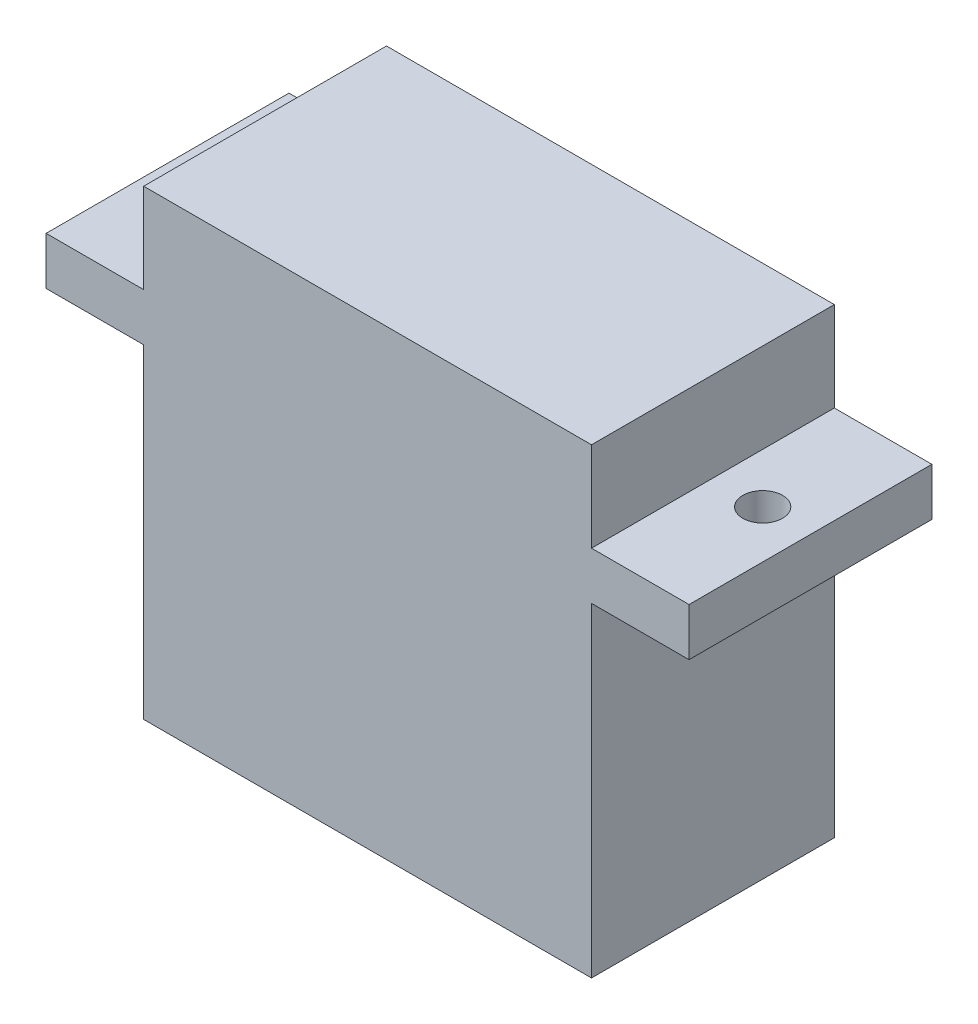
ISO-10303-21;
HEADER;
FILE_DESCRIPTION(('STEP AP214'),'2;1');
FILE_NAME('part.step','',(''),(''),'','','');
FILE_SCHEMA(('AUTOMOTIVE_DESIGN { 1 0 10303 214 1 1 1 1 }'));
ENDSEC;
DATA;
#1=APPLICATION_CONTEXT('core data for automotive mechanical design processes');
#2=APPLICATION_PROTOCOL_DEFINITION('international standard','automotive_design',2000,#1);
#3=PRODUCT_CONTEXT('',#1,'mechanical');
#4=PRODUCT('Part','Part','',(#3));
#5=PRODUCT_RELATED_PRODUCT_CATEGORY('part','',(#4));
#6=PRODUCT_DEFINITION_FORMATION('','',#4);
#7=PRODUCT_DEFINITION_CONTEXT('part definition',#1,'design');
#8=PRODUCT_DEFINITION('design','',#6,#7);
#9=PRODUCT_DEFINITION_SHAPE('','',#8);
#10=(LENGTH_UNIT() NAMED_UNIT(*) SI_UNIT(.MILLI.,.METRE.));
#11=(NAMED_UNIT(*) PLANE_ANGLE_UNIT() SI_UNIT($,.RADIAN.));
#12=(NAMED_UNIT(*) SI_UNIT($,.STERADIAN.) SOLID_ANGLE_UNIT());
#13=UNCERTAINTY_MEASURE_WITH_UNIT(LENGTH_MEASURE(1.E-05),#10,'distance_accuracy_value','');
#14=(GEOMETRIC_REPRESENTATION_CONTEXT(3) GLOBAL_UNCERTAINTY_ASSIGNED_CONTEXT((#13)) GLOBAL_UNIT_ASSIGNED_CONTEXT((#10,
#11,#12)) REPRESENTATION_CONTEXT('',''));
#15=CARTESIAN_POINT('',(0.,0.,0.));
#16=DIRECTION('',(0.,0.,1.));
#17=DIRECTION('',(1.,0.,0.));
#18=AXIS2_PLACEMENT_3D('',#15,#16,#17);
#19=CARTESIAN_POINT('',(16.15,2.4,6.10000000000001));
#20=DIRECTION('',(0.,1.,0.));
#21=DIRECTION('',(0.,0.,1.));
#22=AXIS2_PLACEMENT_3D('',#19,#20,#21);
#23=PLANE('',#22);
#24=DIRECTION('',(0.,0.,-1.));
#25=VECTOR('',#24,1.);
#26=CARTESIAN_POINT('',(11.25,2.4,6.10000000000001));
#27=LINE('',#26,#25);
#28=CARTESIAN_POINT('',(11.25,2.4,6.09999999999999));
#29=VERTEX_POINT('',#28);
#30=CARTESIAN_POINT('',(11.25,2.4,-6.09999999999999));
#31=VERTEX_POINT('',#30);
#32=EDGE_CURVE('E183',#29,#31,#27,.T.);
#33=ORIENTED_EDGE('',*,*,#32,.F.);
#34=DIRECTION('',(1.,0.,0.));
#35=VECTOR('',#34,1.);
#36=CARTESIAN_POINT('',(-16.15,2.4,6.10000000000001));
#37=LINE('',#36,#35);
#38=CARTESIAN_POINT('',(16.15,2.4,6.10000000000001));
#39=VERTEX_POINT('',#38);
#40=EDGE_CURVE('E205',#29,#39,#37,.T.);
#41=ORIENTED_EDGE('',*,*,#40,.T.);
#42=DIRECTION('',(0.,0.,-1.));
#43=VECTOR('',#42,1.);
#44=CARTESIAN_POINT('',(16.15,2.4,-6.09999999999999));
#45=LINE('',#44,#43);
#46=CARTESIAN_POINT('',(16.15,2.4,-6.09999999999999));
#47=VERTEX_POINT('',#46);
#48=EDGE_CURVE('E198',#39,#47,#45,.T.);
#49=ORIENTED_EDGE('',*,*,#48,.T.);
#50=DIRECTION('',(-1.,0.,0.));
#51=VECTOR('',#50,1.);
#52=CARTESIAN_POINT('',(-16.15,2.4,-6.09999999999999));
#53=LINE('',#52,#51);
#54=EDGE_CURVE('E58',#47,#31,#53,.T.);
#55=ORIENTED_EDGE('',*,*,#54,.T.);
#56=EDGE_LOOP('',(#33,#41,#49,#55));
#57=FACE_BOUND('',#56,.T.);
#58=CARTESIAN_POINT('',(13.75,2.4,0.));
#59=DIRECTION('',(0.,1.,0.));
#60=DIRECTION('',(0.,0.,1.));
#61=AXIS2_PLACEMENT_3D('',#58,#59,#60);
#62=CIRCLE('',#61,1.);
#63=CARTESIAN_POINT('',(13.75,2.4,0.999999999999997));
#64=VERTEX_POINT('',#63);
#65=EDGE_CURVE('E186',#64,#64,#62,.T.);
#66=ORIENTED_EDGE('',*,*,#65,.F.);
#67=EDGE_LOOP('',(#66));
#68=FACE_BOUND('',#67,.T.);
#69=ADVANCED_FACE('F35',(#57,#68),#23,.T.);
#70=CARTESIAN_POINT('',(16.15,0.,6.10000000000001));
#71=DIRECTION('',(0.,1.,0.));
#72=DIRECTION('',(0.,0.,1.));
#73=AXIS2_PLACEMENT_3D('',#70,#71,#72);
#74=PLANE('',#73);
#75=CARTESIAN_POINT('',(13.75,0.,0.));
#76=DIRECTION('',(0.,1.,0.));
#77=DIRECTION('',(0.,0.,1.));
#78=AXIS2_PLACEMENT_3D('',#75,#76,#77);
#79=CIRCLE('',#78,1.);
#80=CARTESIAN_POINT('',(13.75,0.,0.999999999999997));
#81=VERTEX_POINT('',#80);
#82=EDGE_CURVE('E185',#81,#81,#79,.T.);
#83=ORIENTED_EDGE('',*,*,#82,.T.);
#84=EDGE_LOOP('',(#83));
#85=FACE_BOUND('',#84,.T.);
#86=DIRECTION('',(1.,0.,0.));
#87=VECTOR('',#86,1.);
#88=CARTESIAN_POINT('',(-16.15,0.,6.10000000000001));
#89=LINE('',#88,#87);
#90=CARTESIAN_POINT('',(11.25,0.,6.10000000000001));
#91=VERTEX_POINT('',#90);
#92=CARTESIAN_POINT('',(16.15,0.,6.10000000000001));
#93=VERTEX_POINT('',#92);
#94=EDGE_CURVE('E217',#91,#93,#89,.T.);
#95=ORIENTED_EDGE('',*,*,#94,.F.);
#96=DIRECTION('',(0.,0.,-1.));
#97=VECTOR('',#96,1.);
#98=CARTESIAN_POINT('',(11.25,0.,6.10000000000001));
#99=LINE('',#98,#97);
#100=CARTESIAN_POINT('',(11.25,0.,-6.09999999999999));
#101=VERTEX_POINT('',#100);
#102=EDGE_CURVE('E131',#91,#101,#99,.T.);
#103=ORIENTED_EDGE('',*,*,#102,.T.);
#104=DIRECTION('',(-1.,0.,0.));
#105=VECTOR('',#104,1.);
#106=CARTESIAN_POINT('',(-16.15,0.,-6.09999999999999));
#107=LINE('',#106,#105);
#108=CARTESIAN_POINT('',(16.15,0.,-6.09999999999999));
#109=VERTEX_POINT('',#108);
#110=EDGE_CURVE('E212',#109,#101,#107,.T.);
#111=ORIENTED_EDGE('',*,*,#110,.F.);
#112=DIRECTION('',(0.,0.,-1.));
#113=VECTOR('',#112,1.);
#114=CARTESIAN_POINT('',(16.15,0.,-6.09999999999999));
#115=LINE('',#114,#113);
#116=EDGE_CURVE('E195',#93,#109,#115,.T.);
#117=ORIENTED_EDGE('',*,*,#116,.F.);
#118=EDGE_LOOP('',(#95,#103,#111,#117));
#119=FACE_BOUND('',#118,.T.);
#120=ADVANCED_FACE('F256',(#85,#119),#74,.F.);
#121=DIRECTION('',(0.,0.,1.));
#122=VECTOR('',#121,1.);
#123=CARTESIAN_POINT('',(-11.25,2.4,6.10000000000001));
#124=LINE('',#123,#122);
#125=CARTESIAN_POINT('',(-11.25,2.4,-6.09999999999999));
#126=VERTEX_POINT('',#125);
#127=CARTESIAN_POINT('',(-11.25,2.4,6.10000000000001));
#128=VERTEX_POINT('',#127);
#129=EDGE_CURVE('E50',#126,#128,#124,.T.);
#130=ORIENTED_EDGE('',*,*,#129,.F.);
#131=CARTESIAN_POINT('',(-16.15,2.4,-6.09999999999999));
#132=VERTEX_POINT('',#131);
#133=EDGE_CURVE('E200',#126,#132,#53,.T.);
#134=ORIENTED_EDGE('',*,*,#133,.T.);
#135=DIRECTION('',(0.,0.,1.));
#136=VECTOR('',#135,1.);
#137=CARTESIAN_POINT('',(-16.15,2.4,-6.09999999999999));
#138=LINE('',#137,#136);
#139=CARTESIAN_POINT('',(-16.15,2.4,6.10000000000001));
#140=VERTEX_POINT('',#139);
#141=EDGE_CURVE('E203',#132,#140,#138,.T.);
#142=ORIENTED_EDGE('',*,*,#141,.T.);
#143=EDGE_CURVE('E206',#140,#128,#37,.T.);
#144=ORIENTED_EDGE('',*,*,#143,.T.);
#145=EDGE_LOOP('',(#130,#134,#142,#144));
#146=FACE_BOUND('',#145,.T.);
#147=CARTESIAN_POINT('',(-13.75,2.4,0.));
#148=DIRECTION('',(0.,1.,0.));
#149=DIRECTION('',(0.,0.,1.));
#150=AXIS2_PLACEMENT_3D('',#147,#148,#149);
#151=CIRCLE('',#150,1.);
#152=CARTESIAN_POINT('',(-13.75,2.4,1.));
#153=VERTEX_POINT('',#152);
#154=EDGE_CURVE('E192',#153,#153,#151,.T.);
#155=ORIENTED_EDGE('',*,*,#154,.F.);
#156=EDGE_LOOP('',(#155));
#157=FACE_BOUND('',#156,.T.);
#158=ADVANCED_FACE('F236',(#146,#157),#23,.T.);
#159=CARTESIAN_POINT('',(-13.75,0.,0.));
#160=DIRECTION('',(0.,1.,0.));
#161=DIRECTION('',(0.,0.,1.));
#162=AXIS2_PLACEMENT_3D('',#159,#160,#161);
#163=CIRCLE('',#162,1.);
#164=CARTESIAN_POINT('',(-13.75,0.,1.));
#165=VERTEX_POINT('',#164);
#166=EDGE_CURVE('E189',#165,#165,#163,.T.);
#167=ORIENTED_EDGE('',*,*,#166,.T.);
#168=EDGE_LOOP('',(#167));
#169=FACE_BOUND('',#168,.T.);
#170=CARTESIAN_POINT('',(-11.25,0.,-6.09999999999999));
#171=VERTEX_POINT('',#170);
#172=CARTESIAN_POINT('',(-16.15,0.,-6.09999999999999));
#173=VERTEX_POINT('',#172);
#174=EDGE_CURVE('E211',#171,#173,#107,.T.);
#175=ORIENTED_EDGE('',*,*,#174,.F.);
#176=DIRECTION('',(0.,0.,1.));
#177=VECTOR('',#176,1.);
#178=CARTESIAN_POINT('',(-11.25,0.,6.10000000000001));
#179=LINE('',#178,#177);
#180=CARTESIAN_POINT('',(-11.25,0.,6.09999999999999));
#181=VERTEX_POINT('',#180);
#182=EDGE_CURVE('E169',#171,#181,#179,.T.);
#183=ORIENTED_EDGE('',*,*,#182,.T.);
#184=CARTESIAN_POINT('',(-16.15,0.,6.10000000000001));
#185=VERTEX_POINT('',#184);
#186=EDGE_CURVE('E201',#185,#181,#89,.T.);
#187=ORIENTED_EDGE('',*,*,#186,.F.);
#188=DIRECTION('',(0.,0.,1.));
#189=VECTOR('',#188,1.);
#190=CARTESIAN_POINT('',(-16.15,0.,-6.09999999999999));
#191=LINE('',#190,#189);
#192=EDGE_CURVE('E215',#173,#185,#191,.T.);
#193=ORIENTED_EDGE('',*,*,#192,.F.);
#194=EDGE_LOOP('',(#175,#183,#187,#193));
#195=FACE_BOUND('',#194,.T.);
#196=ADVANCED_FACE('F234',(#169,#195),#74,.F.);
#197=CARTESIAN_POINT('',(16.15,2.4,-6.09999999999999));
#198=DIRECTION('',(-1.,0.,0.));
#199=DIRECTION('',(0.,0.,1.));
#200=AXIS2_PLACEMENT_3D('',#197,#198,#199);
#201=PLANE('',#200);
#202=ORIENTED_EDGE('',*,*,#116,.T.);
#203=DIRECTION('',(0.,-1.,0.));
#204=VECTOR('',#203,1.);
#205=CARTESIAN_POINT('',(16.15,2.4,-6.09999999999999));
#206=LINE('',#205,#204);
#207=EDGE_CURVE('E11',#47,#109,#206,.T.);
#208=ORIENTED_EDGE('',*,*,#207,.F.);
#209=ORIENTED_EDGE('',*,*,#48,.F.);
#210=DIRECTION('',(0.,-1.,0.));
#211=VECTOR('',#210,1.);
#212=CARTESIAN_POINT('',(16.15,2.4,6.10000000000001));
#213=LINE('',#212,#211);
#214=EDGE_CURVE('E208',#39,#93,#213,.T.);
#215=ORIENTED_EDGE('',*,*,#214,.T.);
#216=EDGE_LOOP('',(#202,#208,#209,#215));
#217=FACE_BOUND('',#216,.T.);
#218=ADVANCED_FACE('F37',(#217),#201,.F.);
#219=CARTESIAN_POINT('',(-16.15,2.4,-6.09999999999999));
#220=DIRECTION('',(0.,0.,1.));
#221=DIRECTION('',(1.,0.,0.));
#222=AXIS2_PLACEMENT_3D('',#219,#220,#221);
#223=PLANE('',#222);
#224=ORIENTED_EDGE('',*,*,#133,.F.);
#225=DIRECTION('',(0.,-1.,0.));
#226=VECTOR('',#225,1.);
#227=CARTESIAN_POINT('',(-11.25,6.9,-6.09999999999999));
#228=LINE('',#227,#226);
#229=CARTESIAN_POINT('',(-11.25,6.9,-6.09999999999999));
#230=VERTEX_POINT('',#229);
#231=EDGE_CURVE('E171',#230,#126,#228,.T.);
#232=ORIENTED_EDGE('',*,*,#231,.F.);
#233=DIRECTION('',(1.,0.,0.));
#234=VECTOR('',#233,1.);
#235=CARTESIAN_POINT('',(-11.25,6.9,-6.09999999999999));
#236=LINE('',#235,#234);
#237=CARTESIAN_POINT('',(11.25,6.9,-6.09999999999999));
#238=VERTEX_POINT('',#237);
#239=EDGE_CURVE('E135',#230,#238,#236,.T.);
#240=ORIENTED_EDGE('',*,*,#239,.T.);
#241=DIRECTION('',(0.,-1.,0.));
#242=VECTOR('',#241,1.);
#243=CARTESIAN_POINT('',(11.25,6.9,-6.09999999999999));
#244=LINE('',#243,#242);
#245=EDGE_CURVE('E166',#238,#31,#244,.T.);
#246=ORIENTED_EDGE('',*,*,#245,.T.);
#247=ORIENTED_EDGE('',*,*,#54,.F.);
#248=ORIENTED_EDGE('',*,*,#207,.T.);
#249=ORIENTED_EDGE('',*,*,#110,.T.);
#250=CARTESIAN_POINT('',(11.25,-16.3,-6.09999999999999));
#251=VERTEX_POINT('',#250);
#252=EDGE_CURVE('E170',#101,#251,#244,.T.);
#253=ORIENTED_EDGE('',*,*,#252,.T.);
#254=DIRECTION('',(1.,0.,0.));
#255=VECTOR('',#254,1.);
#256=CARTESIAN_POINT('',(-11.25,-16.3,-6.09999999999999));
#257=LINE('',#256,#255);
#258=CARTESIAN_POINT('',(-11.25,-16.3,-6.09999999999999));
#259=VERTEX_POINT('',#258);
#260=EDGE_CURVE('E150',#259,#251,#257,.T.);
#261=ORIENTED_EDGE('',*,*,#260,.F.);
#262=EDGE_CURVE('E174',#171,#259,#228,.T.);
#263=ORIENTED_EDGE('',*,*,#262,.F.);
#264=ORIENTED_EDGE('',*,*,#174,.T.);
#265=DIRECTION('',(0.,-1.,0.));
#266=VECTOR('',#265,1.);
#267=CARTESIAN_POINT('',(-16.15,2.4,-6.09999999999999));
#268=LINE('',#267,#266);
#269=EDGE_CURVE('E43',#132,#173,#268,.T.);
#270=ORIENTED_EDGE('',*,*,#269,.F.);
#271=EDGE_LOOP('',(#224,#232,#240,#246,#247,#248,#249,#253,#261,#263,#264,#270));
#272=FACE_BOUND('',#271,.T.);
#273=ADVANCED_FACE('F242',(#272),#223,.F.);
#274=CARTESIAN_POINT('',(-16.15,2.4,-6.09999999999999));
#275=DIRECTION('',(1.,0.,0.));
#276=DIRECTION('',(0.,0.,-1.));
#277=AXIS2_PLACEMENT_3D('',#274,#275,#276);
#278=PLANE('',#277);
#279=ORIENTED_EDGE('',*,*,#192,.T.);
#280=DIRECTION('',(0.,-1.,0.));
#281=VECTOR('',#280,1.);
#282=CARTESIAN_POINT('',(-16.15,2.4,6.10000000000001));
#283=LINE('',#282,#281);
#284=EDGE_CURVE('E221',#140,#185,#283,.T.);
#285=ORIENTED_EDGE('',*,*,#284,.F.);
#286=ORIENTED_EDGE('',*,*,#141,.F.);
#287=ORIENTED_EDGE('',*,*,#269,.T.);
#288=EDGE_LOOP('',(#279,#285,#286,#287));
#289=FACE_BOUND('',#288,.T.);
#290=ADVANCED_FACE('F228',(#289),#278,.F.);
#291=CARTESIAN_POINT('',(-16.15,2.4,6.10000000000001));
#292=DIRECTION('',(0.,0.,-1.));
#293=DIRECTION('',(-1.,0.,0.));
#294=AXIS2_PLACEMENT_3D('',#291,#292,#293);
#295=PLANE('',#294);
#296=ORIENTED_EDGE('',*,*,#186,.T.);
#297=DIRECTION('',(0.,-1.,0.));
#298=VECTOR('',#297,1.);
#299=CARTESIAN_POINT('',(-11.25,6.9,6.09999999999999));
#300=LINE('',#299,#298);
#301=CARTESIAN_POINT('',(-11.25,-16.3,6.09999999999999));
#302=VERTEX_POINT('',#301);
#303=EDGE_CURVE('E141',#181,#302,#300,.T.);
#304=ORIENTED_EDGE('',*,*,#303,.T.);
#305=DIRECTION('',(-1.,0.,0.));
#306=VECTOR('',#305,1.);
#307=CARTESIAN_POINT('',(-11.25,-16.3,6.09999999999999));
#308=LINE('',#307,#306);
#309=CARTESIAN_POINT('',(11.25,-16.3,6.09999999999999));
#310=VERTEX_POINT('',#309);
#311=EDGE_CURVE('E138',#310,#302,#308,.T.);
#312=ORIENTED_EDGE('',*,*,#311,.F.);
#313=DIRECTION('',(0.,-1.,0.));
#314=VECTOR('',#313,1.);
#315=CARTESIAN_POINT('',(11.25,6.9,6.09999999999999));
#316=LINE('',#315,#314);
#317=EDGE_CURVE('E125',#91,#310,#316,.T.);
#318=ORIENTED_EDGE('',*,*,#317,.F.);
#319=ORIENTED_EDGE('',*,*,#94,.T.);
#320=ORIENTED_EDGE('',*,*,#214,.F.);
#321=ORIENTED_EDGE('',*,*,#40,.F.);
#322=CARTESIAN_POINT('',(11.25,6.9,6.09999999999999));
#323=VERTEX_POINT('',#322);
#324=EDGE_CURVE('E134',#323,#29,#316,.T.);
#325=ORIENTED_EDGE('',*,*,#324,.F.);
#326=DIRECTION('',(-1.,0.,0.));
#327=VECTOR('',#326,1.);
#328=CARTESIAN_POINT('',(-11.25,6.9,6.09999999999999));
#329=LINE('',#328,#327);
#330=CARTESIAN_POINT('',(-11.25,6.9,6.09999999999999));
#331=VERTEX_POINT('',#330);
#332=EDGE_CURVE('E158',#323,#331,#329,.T.);
#333=ORIENTED_EDGE('',*,*,#332,.T.);
#334=EDGE_CURVE('E175',#331,#128,#300,.T.);
#335=ORIENTED_EDGE('',*,*,#334,.T.);
#336=ORIENTED_EDGE('',*,*,#143,.F.);
#337=ORIENTED_EDGE('',*,*,#284,.T.);
#338=EDGE_LOOP('',(#296,#304,#312,#318,#319,#320,#321,#325,#333,#335,#336,#337));
#339=FACE_BOUND('',#338,.T.);
#340=ADVANCED_FACE('F140',(#339),#295,.F.);
#341=CARTESIAN_POINT('',(-13.75,2.4,0.));
#342=DIRECTION('',(0.,-1.,0.));
#343=DIRECTION('',(0.,0.,-1.));
#344=AXIS2_PLACEMENT_3D('',#341,#342,#343);
#345=CYLINDRICAL_SURFACE('',#344,1.);
#346=ORIENTED_EDGE('',*,*,#154,.T.);
#347=EDGE_LOOP('',(#346));
#348=FACE_BOUND('',#347,.T.);
#349=ORIENTED_EDGE('',*,*,#166,.F.);
#350=EDGE_LOOP('',(#349));
#351=FACE_BOUND('',#350,.T.);
#352=ADVANCED_FACE('F273',(#348,#351),#345,.F.);
#353=CARTESIAN_POINT('',(13.75,2.4,0.));
#354=DIRECTION('',(0.,-1.,0.));
#355=DIRECTION('',(0.,0.,-1.));
#356=AXIS2_PLACEMENT_3D('',#353,#354,#355);
#357=CYLINDRICAL_SURFACE('',#356,1.);
#358=ORIENTED_EDGE('',*,*,#65,.T.);
#359=EDGE_LOOP('',(#358));
#360=FACE_BOUND('',#359,.T.);
#361=ORIENTED_EDGE('',*,*,#82,.F.);
#362=EDGE_LOOP('',(#361));
#363=FACE_BOUND('',#362,.T.);
#364=ADVANCED_FACE('F275',(#360,#363),#357,.F.);
#365=CARTESIAN_POINT('',(11.25,-16.3,-6.09999999999999));
#366=DIRECTION('',(0.,-1.,0.));
#367=DIRECTION('',(0.,0.,-1.));
#368=AXIS2_PLACEMENT_3D('',#365,#366,#367);
#369=PLANE('',#368);
#370=DIRECTION('',(0.,0.,1.));
#371=VECTOR('',#370,1.);
#372=CARTESIAN_POINT('',(11.25,-16.3,6.09999999999999));
#373=LINE('',#372,#371);
#374=EDGE_CURVE('E129',#251,#310,#373,.T.);
#375=ORIENTED_EDGE('',*,*,#374,.T.);
#376=ORIENTED_EDGE('',*,*,#311,.T.);
#377=DIRECTION('',(0.,0.,-1.));
#378=VECTOR('',#377,1.);
#379=CARTESIAN_POINT('',(-11.25,-16.3,6.09999999999999));
#380=LINE('',#379,#378);
#381=EDGE_CURVE('E145',#302,#259,#380,.T.);
#382=ORIENTED_EDGE('',*,*,#381,.T.);
#383=ORIENTED_EDGE('',*,*,#260,.T.);
#384=EDGE_LOOP('',(#375,#376,#382,#383));
#385=FACE_BOUND('',#384,.T.);
#386=ADVANCED_FACE('F148',(#385),#369,.T.);
#387=CARTESIAN_POINT('',(-11.25,6.9,6.09999999999999));
#388=DIRECTION('',(-1.,0.,0.));
#389=DIRECTION('',(0.,0.,1.));
#390=AXIS2_PLACEMENT_3D('',#387,#388,#389);
#391=PLANE('',#390);
#392=ORIENTED_EDGE('',*,*,#182,.F.);
#393=ORIENTED_EDGE('',*,*,#262,.T.);
#394=ORIENTED_EDGE('',*,*,#381,.F.);
#395=ORIENTED_EDGE('',*,*,#303,.F.);
#396=EDGE_LOOP('',(#392,#393,#394,#395));
#397=FACE_BOUND('',#396,.T.);
#398=ADVANCED_FACE('F289',(#397),#391,.T.);
#399=CARTESIAN_POINT('',(11.25,6.9,6.09999999999999));
#400=DIRECTION('',(1.,0.,0.));
#401=DIRECTION('',(0.,0.,-1.));
#402=AXIS2_PLACEMENT_3D('',#399,#400,#401);
#403=PLANE('',#402);
#404=ORIENTED_EDGE('',*,*,#102,.F.);
#405=ORIENTED_EDGE('',*,*,#317,.T.);
#406=ORIENTED_EDGE('',*,*,#374,.F.);
#407=ORIENTED_EDGE('',*,*,#252,.F.);
#408=EDGE_LOOP('',(#404,#405,#406,#407));
#409=FACE_BOUND('',#408,.T.);
#410=ADVANCED_FACE('F127',(#409),#403,.T.);
#411=ORIENTED_EDGE('',*,*,#324,.T.);
#412=ORIENTED_EDGE('',*,*,#32,.T.);
#413=ORIENTED_EDGE('',*,*,#245,.F.);
#414=DIRECTION('',(0.,0.,1.));
#415=VECTOR('',#414,1.);
#416=CARTESIAN_POINT('',(11.25,6.9,6.09999999999999));
#417=LINE('',#416,#415);
#418=EDGE_CURVE('E155',#238,#323,#417,.T.);
#419=ORIENTED_EDGE('',*,*,#418,.T.);
#420=EDGE_LOOP('',(#411,#412,#413,#419));
#421=FACE_BOUND('',#420,.T.);
#422=ADVANCED_FACE('F248',(#421),#403,.T.);
#423=ORIENTED_EDGE('',*,*,#231,.T.);
#424=ORIENTED_EDGE('',*,*,#129,.T.);
#425=ORIENTED_EDGE('',*,*,#334,.F.);
#426=DIRECTION('',(0.,0.,-1.));
#427=VECTOR('',#426,1.);
#428=CARTESIAN_POINT('',(-11.25,6.9,6.09999999999999));
#429=LINE('',#428,#427);
#430=EDGE_CURVE('E161',#331,#230,#429,.T.);
#431=ORIENTED_EDGE('',*,*,#430,.T.);
#432=EDGE_LOOP('',(#423,#424,#425,#431));
#433=FACE_BOUND('',#432,.T.);
#434=ADVANCED_FACE('F239',(#433),#391,.T.);
#435=CARTESIAN_POINT('',(11.25,6.9,-6.09999999999999));
#436=DIRECTION('',(0.,-1.,0.));
#437=DIRECTION('',(0.,0.,-1.));
#438=AXIS2_PLACEMENT_3D('',#435,#436,#437);
#439=PLANE('',#438);
#440=ORIENTED_EDGE('',*,*,#418,.F.);
#441=ORIENTED_EDGE('',*,*,#239,.F.);
#442=ORIENTED_EDGE('',*,*,#430,.F.);
#443=ORIENTED_EDGE('',*,*,#332,.F.);
#444=EDGE_LOOP('',(#440,#441,#442,#443));
#445=FACE_BOUND('',#444,.T.);
#446=ADVANCED_FACE('F245',(#445),#439,.F.);
#447=CLOSED_SHELL('',(#69,#120,#158,#196,#218,#273,#290,#340,#352,#364,#386,#398,#410,#422,#434,#446));
#448=MANIFOLD_SOLID_BREP('B2',#447);
#449=ADVANCED_BREP_SHAPE_REPRESENTATION('',(#18,#448),#14);
#450=SHAPE_DEFINITION_REPRESENTATION(#9,#449);
ENDSEC;
END-ISO-10303-21;
